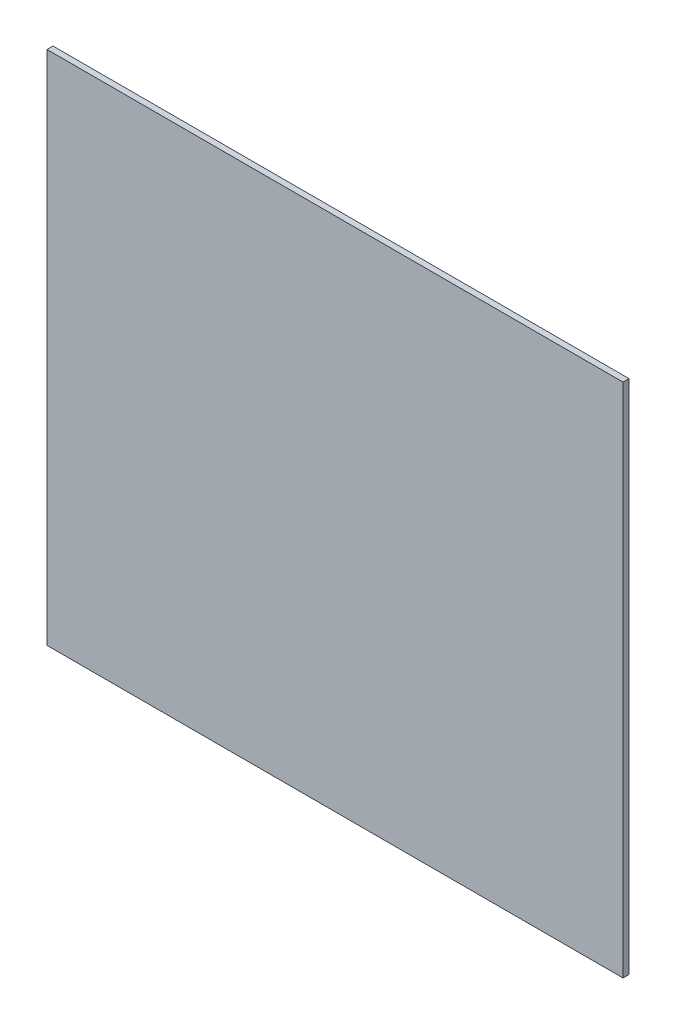
ISO-10303-21;
HEADER;
FILE_DESCRIPTION(('STEP AP214'),'2;1');
FILE_NAME('part.step','',(''),(''),'','','');
FILE_SCHEMA(('AUTOMOTIVE_DESIGN { 1 0 10303 214 1 1 1 1 }'));
ENDSEC;
DATA;
#1=APPLICATION_CONTEXT('core data for automotive mechanical design processes');
#2=APPLICATION_PROTOCOL_DEFINITION('international standard','automotive_design',2000,#1);
#3=PRODUCT_CONTEXT('',#1,'mechanical');
#4=PRODUCT('Part','Part','',(#3));
#5=PRODUCT_RELATED_PRODUCT_CATEGORY('part','',(#4));
#6=PRODUCT_DEFINITION_FORMATION('','',#4);
#7=PRODUCT_DEFINITION_CONTEXT('part definition',#1,'design');
#8=PRODUCT_DEFINITION('design','',#6,#7);
#9=PRODUCT_DEFINITION_SHAPE('','',#8);
#10=(LENGTH_UNIT() NAMED_UNIT(*) SI_UNIT(.MILLI.,.METRE.));
#11=(NAMED_UNIT(*) PLANE_ANGLE_UNIT() SI_UNIT($,.RADIAN.));
#12=(NAMED_UNIT(*) SI_UNIT($,.STERADIAN.) SOLID_ANGLE_UNIT());
#13=UNCERTAINTY_MEASURE_WITH_UNIT(LENGTH_MEASURE(1.E-05),#10,'distance_accuracy_value','');
#14=(GEOMETRIC_REPRESENTATION_CONTEXT(3) GLOBAL_UNCERTAINTY_ASSIGNED_CONTEXT((#13)) GLOBAL_UNIT_ASSIGNED_CONTEXT((#10,
#11,#12)) REPRESENTATION_CONTEXT('',''));
#15=CARTESIAN_POINT('',(0.,0.,0.));
#16=DIRECTION('',(0.,0.,1.));
#17=DIRECTION('',(1.,0.,0.));
#18=AXIS2_PLACEMENT_3D('',#15,#16,#17);
#19=CARTESIAN_POINT('',(1200.,-1075.,25.));
#20=DIRECTION('',(-1.,0.,0.));
#21=DIRECTION('',(0.,0.,1.));
#22=AXIS2_PLACEMENT_3D('',#19,#20,#21);
#23=PLANE('',#22);
#24=DIRECTION('',(0.,1.,0.));
#25=VECTOR('',#24,1.);
#26=CARTESIAN_POINT('',(1200.,-1075.,0.));
#27=LINE('',#26,#25);
#28=CARTESIAN_POINT('',(1200.,-1075.,0.));
#29=VERTEX_POINT('',#28);
#30=CARTESIAN_POINT('',(1200.,1075.,0.));
#31=VERTEX_POINT('',#30);
#32=EDGE_CURVE('E113',#29,#31,#27,.T.);
#33=ORIENTED_EDGE('',*,*,#32,.T.);
#34=DIRECTION('',(0.,0.,-1.));
#35=VECTOR('',#34,1.);
#36=CARTESIAN_POINT('',(1200.,1075.,25.));
#37=LINE('',#36,#35);
#38=CARTESIAN_POINT('',(1200.,1075.,25.));
#39=VERTEX_POINT('',#38);
#40=EDGE_CURVE('E11',#39,#31,#37,.T.);
#41=ORIENTED_EDGE('',*,*,#40,.F.);
#42=DIRECTION('',(0.,1.,0.));
#43=VECTOR('',#42,1.);
#44=CARTESIAN_POINT('',(1200.,-1075.,25.));
#45=LINE('',#44,#43);
#46=CARTESIAN_POINT('',(1200.,-1075.,25.));
#47=VERTEX_POINT('',#46);
#48=EDGE_CURVE('E97',#47,#39,#45,.T.);
#49=ORIENTED_EDGE('',*,*,#48,.F.);
#50=DIRECTION('',(0.,0.,-1.));
#51=VECTOR('',#50,1.);
#52=CARTESIAN_POINT('',(1200.,-1075.,25.));
#53=LINE('',#52,#51);
#54=EDGE_CURVE('E109',#47,#29,#53,.T.);
#55=ORIENTED_EDGE('',*,*,#54,.T.);
#56=EDGE_LOOP('',(#33,#41,#49,#55));
#57=FACE_BOUND('',#56,.T.);
#58=ADVANCED_FACE('F45',(#57),#23,.F.);
#59=CARTESIAN_POINT('',(-1200.,1075.,25.));
#60=DIRECTION('',(0.,-1.,0.));
#61=DIRECTION('',(0.,0.,-1.));
#62=AXIS2_PLACEMENT_3D('',#59,#60,#61);
#63=PLANE('',#62);
#64=DIRECTION('',(-1.,0.,0.));
#65=VECTOR('',#64,1.);
#66=CARTESIAN_POINT('',(-1200.,1075.,0.));
#67=LINE('',#66,#65);
#68=CARTESIAN_POINT('',(-1200.,1075.,0.));
#69=VERTEX_POINT('',#68);
#70=EDGE_CURVE('E102',#31,#69,#67,.T.);
#71=ORIENTED_EDGE('',*,*,#70,.T.);
#72=DIRECTION('',(0.,0.,-1.));
#73=VECTOR('',#72,1.);
#74=CARTESIAN_POINT('',(-1200.,1075.,25.));
#75=LINE('',#74,#73);
#76=CARTESIAN_POINT('',(-1200.,1075.,25.));
#77=VERTEX_POINT('',#76);
#78=EDGE_CURVE('E54',#77,#69,#75,.T.);
#79=ORIENTED_EDGE('',*,*,#78,.F.);
#80=DIRECTION('',(-1.,0.,0.));
#81=VECTOR('',#80,1.);
#82=CARTESIAN_POINT('',(-1200.,1075.,25.));
#83=LINE('',#82,#81);
#84=EDGE_CURVE('E92',#39,#77,#83,.T.);
#85=ORIENTED_EDGE('',*,*,#84,.F.);
#86=ORIENTED_EDGE('',*,*,#40,.T.);
#87=EDGE_LOOP('',(#71,#79,#85,#86));
#88=FACE_BOUND('',#87,.T.);
#89=ADVANCED_FACE('F101',(#88),#63,.F.);
#90=CARTESIAN_POINT('',(-1200.,-1075.,25.));
#91=DIRECTION('',(1.,0.,0.));
#92=DIRECTION('',(0.,0.,-1.));
#93=AXIS2_PLACEMENT_3D('',#90,#91,#92);
#94=PLANE('',#93);
#95=DIRECTION('',(0.,-1.,0.));
#96=VECTOR('',#95,1.);
#97=CARTESIAN_POINT('',(-1200.,-1075.,0.));
#98=LINE('',#97,#96);
#99=CARTESIAN_POINT('',(-1200.,-1075.,0.));
#100=VERTEX_POINT('',#99);
#101=EDGE_CURVE('E79',#69,#100,#98,.T.);
#102=ORIENTED_EDGE('',*,*,#101,.T.);
#103=DIRECTION('',(0.,0.,-1.));
#104=VECTOR('',#103,1.);
#105=CARTESIAN_POINT('',(-1200.,-1075.,25.));
#106=LINE('',#105,#104);
#107=CARTESIAN_POINT('',(-1200.,-1075.,25.));
#108=VERTEX_POINT('',#107);
#109=EDGE_CURVE('E104',#108,#100,#106,.T.);
#110=ORIENTED_EDGE('',*,*,#109,.F.);
#111=DIRECTION('',(0.,-1.,0.));
#112=VECTOR('',#111,1.);
#113=CARTESIAN_POINT('',(-1200.,-1075.,25.));
#114=LINE('',#113,#112);
#115=EDGE_CURVE('E95',#77,#108,#114,.T.);
#116=ORIENTED_EDGE('',*,*,#115,.F.);
#117=ORIENTED_EDGE('',*,*,#78,.T.);
#118=EDGE_LOOP('',(#102,#110,#116,#117));
#119=FACE_BOUND('',#118,.T.);
#120=ADVANCED_FACE('F105',(#119),#94,.F.);
#121=CARTESIAN_POINT('',(-1200.,-1075.,25.));
#122=DIRECTION('',(0.,1.,0.));
#123=DIRECTION('',(0.,0.,1.));
#124=AXIS2_PLACEMENT_3D('',#121,#122,#123);
#125=PLANE('',#124);
#126=DIRECTION('',(1.,0.,0.));
#127=VECTOR('',#126,1.);
#128=CARTESIAN_POINT('',(-1200.,-1075.,0.));
#129=LINE('',#128,#127);
#130=EDGE_CURVE('E85',#100,#29,#129,.T.);
#131=ORIENTED_EDGE('',*,*,#130,.T.);
#132=ORIENTED_EDGE('',*,*,#54,.F.);
#133=DIRECTION('',(1.,0.,0.));
#134=VECTOR('',#133,1.);
#135=CARTESIAN_POINT('',(-1200.,-1075.,25.));
#136=LINE('',#135,#134);
#137=EDGE_CURVE('E62',#108,#47,#136,.T.);
#138=ORIENTED_EDGE('',*,*,#137,.F.);
#139=ORIENTED_EDGE('',*,*,#109,.T.);
#140=EDGE_LOOP('',(#131,#132,#138,#139));
#141=FACE_BOUND('',#140,.T.);
#142=ADVANCED_FACE('F126',(#141),#125,.F.);
#143=CARTESIAN_POINT('',(0.,0.,25.));
#144=DIRECTION('',(0.,0.,-1.));
#145=DIRECTION('',(-1.,0.,0.));
#146=AXIS2_PLACEMENT_3D('',#143,#144,#145);
#147=PLANE('',#146);
#148=ORIENTED_EDGE('',*,*,#48,.T.);
#149=ORIENTED_EDGE('',*,*,#84,.T.);
#150=ORIENTED_EDGE('',*,*,#115,.T.);
#151=ORIENTED_EDGE('',*,*,#137,.T.);
#152=EDGE_LOOP('',(#148,#149,#150,#151));
#153=FACE_BOUND('',#152,.T.);
#154=ADVANCED_FACE('F93',(#153),#147,.F.);
#155=CARTESIAN_POINT('',(0.,0.,0.));
#156=DIRECTION('',(0.,0.,-1.));
#157=DIRECTION('',(-1.,0.,0.));
#158=AXIS2_PLACEMENT_3D('',#155,#156,#157);
#159=PLANE('',#158);
#160=ORIENTED_EDGE('',*,*,#32,.F.);
#161=ORIENTED_EDGE('',*,*,#130,.F.);
#162=ORIENTED_EDGE('',*,*,#101,.F.);
#163=ORIENTED_EDGE('',*,*,#70,.F.);
#164=EDGE_LOOP('',(#160,#161,#162,#163));
#165=FACE_BOUND('',#164,.T.);
#166=ADVANCED_FACE('F129',(#165),#159,.T.);
#167=CLOSED_SHELL('',(#58,#89,#120,#142,#154,#166));
#168=MANIFOLD_SOLID_BREP('B2',#167);
#169=ADVANCED_BREP_SHAPE_REPRESENTATION('',(#18,#168),#14);
#170=SHAPE_DEFINITION_REPRESENTATION(#9,#169);
ENDSEC;
END-ISO-10303-21;
